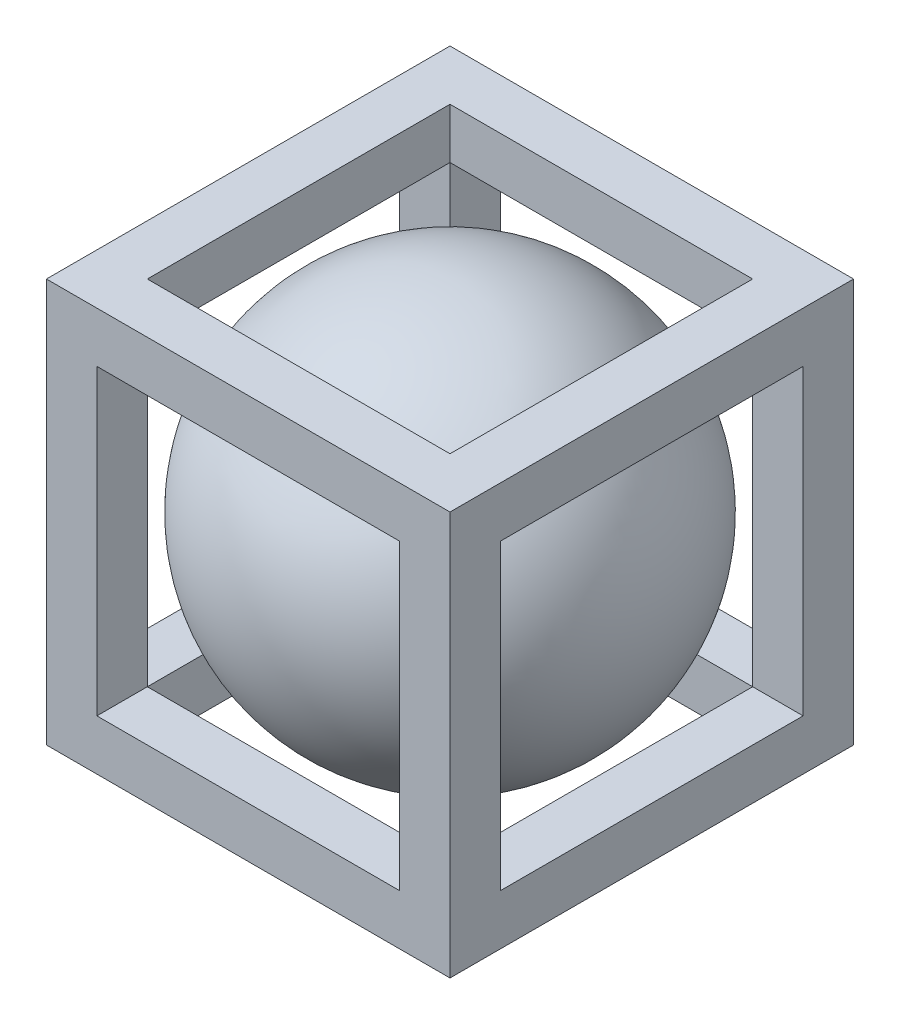
ISO-10303-21;
HEADER;
FILE_DESCRIPTION(('STEP AP214'),'2;1');
FILE_NAME('part.step','',(''),(''),'','','');
FILE_SCHEMA(('AUTOMOTIVE_DESIGN { 1 0 10303 214 1 1 1 1 }'));
ENDSEC;
DATA;
#1=APPLICATION_CONTEXT('core data for automotive mechanical design processes');
#2=APPLICATION_PROTOCOL_DEFINITION('international standard','automotive_design',2000,#1);
#3=PRODUCT_CONTEXT('',#1,'mechanical');
#4=PRODUCT('Part','Part','',(#3));
#5=PRODUCT_RELATED_PRODUCT_CATEGORY('part','',(#4));
#6=PRODUCT_DEFINITION_FORMATION('','',#4);
#7=PRODUCT_DEFINITION_CONTEXT('part definition',#1,'design');
#8=PRODUCT_DEFINITION('design','',#6,#7);
#9=PRODUCT_DEFINITION_SHAPE('','',#8);
#10=(LENGTH_UNIT() NAMED_UNIT(*) SI_UNIT(.MILLI.,.METRE.));
#11=(NAMED_UNIT(*) PLANE_ANGLE_UNIT() SI_UNIT($,.RADIAN.));
#12=(NAMED_UNIT(*) SI_UNIT($,.STERADIAN.) SOLID_ANGLE_UNIT());
#13=UNCERTAINTY_MEASURE_WITH_UNIT(LENGTH_MEASURE(1.E-05),#10,'distance_accuracy_value','');
#14=(GEOMETRIC_REPRESENTATION_CONTEXT(3) GLOBAL_UNCERTAINTY_ASSIGNED_CONTEXT((#13)) GLOBAL_UNIT_ASSIGNED_CONTEXT((#10,
#11,#12)) REPRESENTATION_CONTEXT('',''));
#15=CARTESIAN_POINT('',(0.,0.,0.));
#16=DIRECTION('',(0.,0.,1.));
#17=DIRECTION('',(1.,0.,0.));
#18=AXIS2_PLACEMENT_3D('',#15,#16,#17);
#19=CARTESIAN_POINT('',(0.,0.,0.));
#20=DIRECTION('',(-1.,0.,0.));
#21=DIRECTION('',(0.,1.,0.));
#22=AXIS2_PLACEMENT_3D('',#19,#20,#21);
#23=SPHERICAL_SURFACE('',#22,20.);
#24=CARTESIAN_POINT('',(-20.,0.,0.));
#25=VERTEX_POINT('',#24);
#26=VERTEX_LOOP('',#25);
#27=FACE_BOUND('',#26,.T.);
#28=ADVANCED_FACE('F45',(#27),#23,.T.);
#29=CLOSED_SHELL('',(#28));
#30=MANIFOLD_SOLID_BREP('B2',#29);
#31=CARTESIAN_POINT('',(15.,-15.,-20.));
#32=DIRECTION('',(1.,0.,0.));
#33=DIRECTION('',(0.,0.,-1.));
#34=AXIS2_PLACEMENT_3D('',#31,#32,#33);
#35=PLANE('',#34);
#36=DIRECTION('',(0.,0.,1.));
#37=VECTOR('',#36,1.);
#38=CARTESIAN_POINT('',(15.,-15.,-20.));
#39=LINE('',#38,#37);
#40=CARTESIAN_POINT('',(15.,-15.,-20.));
#41=VERTEX_POINT('',#40);
#42=CARTESIAN_POINT('',(15.,-15.,-15.));
#43=VERTEX_POINT('',#42);
#44=EDGE_CURVE('E331',#41,#43,#39,.T.);
#45=ORIENTED_EDGE('',*,*,#44,.T.);
#46=DIRECTION('',(0.,1.,0.));
#47=VECTOR('',#46,1.);
#48=CARTESIAN_POINT('',(15.,-15.,-15.));
#49=LINE('',#48,#47);
#50=CARTESIAN_POINT('',(15.,15.,-15.));
#51=VERTEX_POINT('',#50);
#52=EDGE_CURVE('E257',#43,#51,#49,.T.);
#53=ORIENTED_EDGE('',*,*,#52,.T.);
#54=DIRECTION('',(0.,0.,1.));
#55=VECTOR('',#54,1.);
#56=CARTESIAN_POINT('',(15.,15.,-20.));
#57=LINE('',#56,#55);
#58=CARTESIAN_POINT('',(15.,15.,-20.));
#59=VERTEX_POINT('',#58);
#60=EDGE_CURVE('E344',#59,#51,#57,.T.);
#61=ORIENTED_EDGE('',*,*,#60,.F.);
#62=DIRECTION('',(0.,1.,0.));
#63=VECTOR('',#62,1.);
#64=CARTESIAN_POINT('',(15.,-15.,-20.));
#65=LINE('',#64,#63);
#66=EDGE_CURVE('E318',#41,#59,#65,.T.);
#67=ORIENTED_EDGE('',*,*,#66,.F.);
#68=EDGE_LOOP('',(#45,#53,#61,#67));
#69=FACE_BOUND('',#68,.T.);
#70=ADVANCED_FACE('F58',(#69),#35,.F.);
#71=DIRECTION('',(0.,1.,0.));
#72=VECTOR('',#71,1.);
#73=CARTESIAN_POINT('',(15.,-20.,15.));
#74=LINE('',#73,#72);
#75=CARTESIAN_POINT('',(15.,-20.,15.));
#76=VERTEX_POINT('',#75);
#77=CARTESIAN_POINT('',(15.,-15.,15.));
#78=VERTEX_POINT('',#77);
#79=EDGE_CURVE('E285',#76,#78,#74,.T.);
#80=ORIENTED_EDGE('',*,*,#79,.T.);
#81=DIRECTION('',(0.,0.,-1.));
#82=VECTOR('',#81,1.);
#83=CARTESIAN_POINT('',(15.,-15.,-20.));
#84=LINE('',#83,#82);
#85=EDGE_CURVE('E246',#78,#43,#84,.T.);
#86=ORIENTED_EDGE('',*,*,#85,.T.);
#87=DIRECTION('',(0.,1.,0.));
#88=VECTOR('',#87,1.);
#89=CARTESIAN_POINT('',(15.,-20.,-15.));
#90=LINE('',#89,#88);
#91=CARTESIAN_POINT('',(15.,-20.,-15.));
#92=VERTEX_POINT('',#91);
#93=EDGE_CURVE('E298',#92,#43,#90,.T.);
#94=ORIENTED_EDGE('',*,*,#93,.F.);
#95=DIRECTION('',(0.,0.,-1.));
#96=VECTOR('',#95,1.);
#97=CARTESIAN_POINT('',(15.,-20.,15.));
#98=LINE('',#97,#96);
#99=EDGE_CURVE('E272',#76,#92,#98,.T.);
#100=ORIENTED_EDGE('',*,*,#99,.F.);
#101=EDGE_LOOP('',(#80,#86,#94,#100));
#102=FACE_BOUND('',#101,.T.);
#103=ADVANCED_FACE('F431',(#102),#35,.F.);
#104=CARTESIAN_POINT('',(15.,15.,15.));
#105=VERTEX_POINT('',#104);
#106=CARTESIAN_POINT('',(15.,15.,20.));
#107=VERTEX_POINT('',#106);
#108=EDGE_CURVE('E330',#105,#107,#57,.T.);
#109=ORIENTED_EDGE('',*,*,#108,.F.);
#110=DIRECTION('',(0.,-1.,0.));
#111=VECTOR('',#110,1.);
#112=CARTESIAN_POINT('',(15.,-15.,15.));
#113=LINE('',#112,#111);
#114=EDGE_CURVE('E205',#105,#78,#113,.T.);
#115=ORIENTED_EDGE('',*,*,#114,.T.);
#116=CARTESIAN_POINT('',(15.,-15.,20.));
#117=VERTEX_POINT('',#116);
#118=EDGE_CURVE('E335',#78,#117,#39,.T.);
#119=ORIENTED_EDGE('',*,*,#118,.T.);
#120=DIRECTION('',(0.,1.,0.));
#121=VECTOR('',#120,1.);
#122=CARTESIAN_POINT('',(15.,-15.,20.));
#123=LINE('',#122,#121);
#124=EDGE_CURVE('E306',#117,#107,#123,.T.);
#125=ORIENTED_EDGE('',*,*,#124,.T.);
#126=EDGE_LOOP('',(#109,#115,#119,#125));
#127=FACE_BOUND('',#126,.T.);
#128=ADVANCED_FACE('F390',(#127),#35,.F.);
#129=CARTESIAN_POINT('',(-15.,-15.,-20.));
#130=DIRECTION('',(-1.,0.,0.));
#131=DIRECTION('',(0.,0.,1.));
#132=AXIS2_PLACEMENT_3D('',#129,#130,#131);
#133=PLANE('',#132);
#134=DIRECTION('',(0.,0.,1.));
#135=VECTOR('',#134,1.);
#136=CARTESIAN_POINT('',(-15.,15.,-20.));
#137=LINE('',#136,#135);
#138=CARTESIAN_POINT('',(-15.,15.,-20.));
#139=VERTEX_POINT('',#138);
#140=CARTESIAN_POINT('',(-15.,15.,-15.));
#141=VERTEX_POINT('',#140);
#142=EDGE_CURVE('E340',#139,#141,#137,.T.);
#143=ORIENTED_EDGE('',*,*,#142,.T.);
#144=DIRECTION('',(0.,-1.,0.));
#145=VECTOR('',#144,1.);
#146=CARTESIAN_POINT('',(-15.,-15.,-15.));
#147=LINE('',#146,#145);
#148=CARTESIAN_POINT('',(-15.,-15.,-15.));
#149=VERTEX_POINT('',#148);
#150=EDGE_CURVE('E254',#141,#149,#147,.T.);
#151=ORIENTED_EDGE('',*,*,#150,.T.);
#152=DIRECTION('',(0.,0.,1.));
#153=VECTOR('',#152,1.);
#154=CARTESIAN_POINT('',(-15.,-15.,-20.));
#155=LINE('',#154,#153);
#156=CARTESIAN_POINT('',(-15.,-15.,-20.));
#157=VERTEX_POINT('',#156);
#158=EDGE_CURVE('E336',#157,#149,#155,.T.);
#159=ORIENTED_EDGE('',*,*,#158,.F.);
#160=DIRECTION('',(0.,-1.,0.));
#161=VECTOR('',#160,1.);
#162=CARTESIAN_POINT('',(-15.,-15.,-20.));
#163=LINE('',#162,#161);
#164=EDGE_CURVE('E324',#139,#157,#163,.T.);
#165=ORIENTED_EDGE('',*,*,#164,.F.);
#166=EDGE_LOOP('',(#143,#151,#159,#165));
#167=FACE_BOUND('',#166,.T.);
#168=ADVANCED_FACE('F447',(#167),#133,.F.);
#169=DIRECTION('',(0.,1.,0.));
#170=VECTOR('',#169,1.);
#171=CARTESIAN_POINT('',(-15.,-20.,-15.));
#172=LINE('',#171,#170);
#173=CARTESIAN_POINT('',(-15.,-20.,-15.));
#174=VERTEX_POINT('',#173);
#175=EDGE_CURVE('E294',#174,#149,#172,.T.);
#176=ORIENTED_EDGE('',*,*,#175,.T.);
#177=DIRECTION('',(0.,0.,1.));
#178=VECTOR('',#177,1.);
#179=CARTESIAN_POINT('',(-15.,-15.,-20.));
#180=LINE('',#179,#178);
#181=CARTESIAN_POINT('',(-15.,-15.,15.));
#182=VERTEX_POINT('',#181);
#183=EDGE_CURVE('E237',#149,#182,#180,.T.);
#184=ORIENTED_EDGE('',*,*,#183,.T.);
#185=DIRECTION('',(0.,1.,0.));
#186=VECTOR('',#185,1.);
#187=CARTESIAN_POINT('',(-15.,-20.,15.));
#188=LINE('',#187,#186);
#189=CARTESIAN_POINT('',(-15.,-20.,15.));
#190=VERTEX_POINT('',#189);
#191=EDGE_CURVE('E290',#190,#182,#188,.T.);
#192=ORIENTED_EDGE('',*,*,#191,.F.);
#193=DIRECTION('',(0.,0.,1.));
#194=VECTOR('',#193,1.);
#195=CARTESIAN_POINT('',(-15.,-20.,15.));
#196=LINE('',#195,#194);
#197=EDGE_CURVE('E278',#174,#190,#196,.T.);
#198=ORIENTED_EDGE('',*,*,#197,.F.);
#199=EDGE_LOOP('',(#176,#184,#192,#198));
#200=FACE_BOUND('',#199,.T.);
#201=ADVANCED_FACE('F408',(#200),#133,.F.);
#202=CARTESIAN_POINT('',(-15.,-15.,20.));
#203=VERTEX_POINT('',#202);
#204=EDGE_CURVE('E339',#182,#203,#155,.T.);
#205=ORIENTED_EDGE('',*,*,#204,.F.);
#206=DIRECTION('',(0.,1.,0.));
#207=VECTOR('',#206,1.);
#208=CARTESIAN_POINT('',(-15.,-15.,15.));
#209=LINE('',#208,#207);
#210=CARTESIAN_POINT('',(-15.,15.,15.));
#211=VERTEX_POINT('',#210);
#212=EDGE_CURVE('E43',#182,#211,#209,.T.);
#213=ORIENTED_EDGE('',*,*,#212,.T.);
#214=CARTESIAN_POINT('',(-15.,15.,20.));
#215=VERTEX_POINT('',#214);
#216=EDGE_CURVE('E343',#211,#215,#137,.T.);
#217=ORIENTED_EDGE('',*,*,#216,.T.);
#218=DIRECTION('',(0.,-1.,0.));
#219=VECTOR('',#218,1.);
#220=CARTESIAN_POINT('',(-15.,-15.,20.));
#221=LINE('',#220,#219);
#222=EDGE_CURVE('E312',#215,#203,#221,.T.);
#223=ORIENTED_EDGE('',*,*,#222,.T.);
#224=EDGE_LOOP('',(#205,#213,#217,#223));
#225=FACE_BOUND('',#224,.T.);
#226=ADVANCED_FACE('F402',(#225),#133,.F.);
#227=CARTESIAN_POINT('',(-15.,-15.,-20.));
#228=DIRECTION('',(0.,-1.,0.));
#229=DIRECTION('',(0.,0.,-1.));
#230=AXIS2_PLACEMENT_3D('',#227,#228,#229);
#231=PLANE('',#230);
#232=ORIENTED_EDGE('',*,*,#118,.F.);
#233=DIRECTION('',(-1.,0.,0.));
#234=VECTOR('',#233,1.);
#235=CARTESIAN_POINT('',(-15.,-15.,15.));
#236=LINE('',#235,#234);
#237=EDGE_CURVE('E303',#78,#182,#236,.T.);
#238=ORIENTED_EDGE('',*,*,#237,.T.);
#239=ORIENTED_EDGE('',*,*,#204,.T.);
#240=DIRECTION('',(1.,0.,0.));
#241=VECTOR('',#240,1.);
#242=CARTESIAN_POINT('',(-15.,-15.,20.));
#243=LINE('',#242,#241);
#244=EDGE_CURVE('E315',#203,#117,#243,.T.);
#245=ORIENTED_EDGE('',*,*,#244,.T.);
#246=EDGE_LOOP('',(#232,#238,#239,#245));
#247=FACE_BOUND('',#246,.T.);
#248=ADVANCED_FACE('F414',(#247),#231,.F.);
#249=CARTESIAN_POINT('',(-15.,15.,-20.));
#250=DIRECTION('',(0.,1.,0.));
#251=DIRECTION('',(0.,0.,1.));
#252=AXIS2_PLACEMENT_3D('',#249,#250,#251);
#253=PLANE('',#252);
#254=ORIENTED_EDGE('',*,*,#216,.F.);
#255=DIRECTION('',(1.,0.,0.));
#256=VECTOR('',#255,1.);
#257=CARTESIAN_POINT('',(-15.,15.,15.));
#258=LINE('',#257,#256);
#259=EDGE_CURVE('E66',#211,#105,#258,.T.);
#260=ORIENTED_EDGE('',*,*,#259,.T.);
#261=ORIENTED_EDGE('',*,*,#108,.T.);
#262=DIRECTION('',(-1.,0.,0.));
#263=VECTOR('',#262,1.);
#264=CARTESIAN_POINT('',(-15.,15.,20.));
#265=LINE('',#264,#263);
#266=EDGE_CURVE('E309',#107,#215,#265,.T.);
#267=ORIENTED_EDGE('',*,*,#266,.T.);
#268=EDGE_LOOP('',(#254,#260,#261,#267));
#269=FACE_BOUND('',#268,.T.);
#270=ADVANCED_FACE('F385',(#269),#253,.F.);
#271=CARTESIAN_POINT('',(20.,-20.,-20.));
#272=DIRECTION('',(1.,0.,0.));
#273=DIRECTION('',(0.,0.,-1.));
#274=AXIS2_PLACEMENT_3D('',#271,#272,#273);
#275=PLANE('',#274);
#276=DIRECTION('',(0.,1.,0.));
#277=VECTOR('',#276,1.);
#278=CARTESIAN_POINT('',(20.,-15.,-15.));
#279=LINE('',#278,#277);
#280=CARTESIAN_POINT('',(20.,-15.,-15.));
#281=VERTEX_POINT('',#280);
#282=CARTESIAN_POINT('',(20.,15.,-15.));
#283=VERTEX_POINT('',#282);
#284=EDGE_CURVE('E73',#281,#283,#279,.T.);
#285=ORIENTED_EDGE('',*,*,#284,.F.);
#286=DIRECTION('',(0.,0.,-1.));
#287=VECTOR('',#286,1.);
#288=CARTESIAN_POINT('',(20.,-15.,15.));
#289=LINE('',#288,#287);
#290=CARTESIAN_POINT('',(20.,-15.,15.));
#291=VERTEX_POINT('',#290);
#292=EDGE_CURVE('E219',#291,#281,#289,.T.);
#293=ORIENTED_EDGE('',*,*,#292,.F.);
#294=DIRECTION('',(0.,-1.,0.));
#295=VECTOR('',#294,1.);
#296=CARTESIAN_POINT('',(20.,-15.,15.));
#297=LINE('',#296,#295);
#298=CARTESIAN_POINT('',(20.,15.,15.));
#299=VERTEX_POINT('',#298);
#300=EDGE_CURVE('E202',#299,#291,#297,.T.);
#301=ORIENTED_EDGE('',*,*,#300,.F.);
#302=DIRECTION('',(0.,0.,1.));
#303=VECTOR('',#302,1.);
#304=CARTESIAN_POINT('',(20.,15.,15.));
#305=LINE('',#304,#303);
#306=EDGE_CURVE('E212',#283,#299,#305,.T.);
#307=ORIENTED_EDGE('',*,*,#306,.F.);
#308=EDGE_LOOP('',(#285,#293,#301,#307));
#309=FACE_BOUND('',#308,.T.);
#310=DIRECTION('',(0.,0.,1.));
#311=VECTOR('',#310,1.);
#312=CARTESIAN_POINT('',(20.,20.,-20.));
#313=LINE('',#312,#311);
#314=CARTESIAN_POINT('',(20.,20.,-20.));
#315=VERTEX_POINT('',#314);
#316=CARTESIAN_POINT('',(20.,20.,20.));
#317=VERTEX_POINT('',#316);
#318=EDGE_CURVE('E370',#315,#317,#313,.T.);
#319=ORIENTED_EDGE('',*,*,#318,.T.);
#320=DIRECTION('',(0.,1.,0.));
#321=VECTOR('',#320,1.);
#322=CARTESIAN_POINT('',(20.,-20.,20.));
#323=LINE('',#322,#321);
#324=CARTESIAN_POINT('',(20.,-20.,20.));
#325=VERTEX_POINT('',#324);
#326=EDGE_CURVE('E334',#325,#317,#323,.T.);
#327=ORIENTED_EDGE('',*,*,#326,.F.);
#328=DIRECTION('',(0.,0.,1.));
#329=VECTOR('',#328,1.);
#330=CARTESIAN_POINT('',(20.,-20.,-20.));
#331=LINE('',#330,#329);
#332=CARTESIAN_POINT('',(20.,-20.,-20.));
#333=VERTEX_POINT('',#332);
#334=EDGE_CURVE('E371',#333,#325,#331,.T.);
#335=ORIENTED_EDGE('',*,*,#334,.F.);
#336=DIRECTION('',(0.,1.,0.));
#337=VECTOR('',#336,1.);
#338=CARTESIAN_POINT('',(20.,-20.,-20.));
#339=LINE('',#338,#337);
#340=EDGE_CURVE('E358',#333,#315,#339,.T.);
#341=ORIENTED_EDGE('',*,*,#340,.T.);
#342=EDGE_LOOP('',(#319,#327,#335,#341));
#343=FACE_BOUND('',#342,.T.);
#344=ADVANCED_FACE('F60',(#309,#343),#275,.T.);
#345=CARTESIAN_POINT('',(-20.,-20.,-20.));
#346=DIRECTION('',(0.,-1.,0.));
#347=DIRECTION('',(0.,0.,-1.));
#348=AXIS2_PLACEMENT_3D('',#345,#346,#347);
#349=PLANE('',#348);
#350=ORIENTED_EDGE('',*,*,#99,.T.);
#351=DIRECTION('',(-1.,0.,0.));
#352=VECTOR('',#351,1.);
#353=CARTESIAN_POINT('',(-15.,-20.,-15.));
#354=LINE('',#353,#352);
#355=EDGE_CURVE('E275',#92,#174,#354,.T.);
#356=ORIENTED_EDGE('',*,*,#355,.T.);
#357=ORIENTED_EDGE('',*,*,#197,.T.);
#358=DIRECTION('',(1.,0.,0.));
#359=VECTOR('',#358,1.);
#360=CARTESIAN_POINT('',(-15.,-20.,15.));
#361=LINE('',#360,#359);
#362=EDGE_CURVE('E281',#190,#76,#361,.T.);
#363=ORIENTED_EDGE('',*,*,#362,.T.);
#364=EDGE_LOOP('',(#350,#356,#357,#363));
#365=FACE_BOUND('',#364,.T.);
#366=ORIENTED_EDGE('',*,*,#334,.T.);
#367=DIRECTION('',(1.,0.,0.));
#368=VECTOR('',#367,1.);
#369=CARTESIAN_POINT('',(-20.,-20.,20.));
#370=LINE('',#369,#368);
#371=CARTESIAN_POINT('',(-20.,-20.,20.));
#372=VERTEX_POINT('',#371);
#373=EDGE_CURVE('E355',#372,#325,#370,.T.);
#374=ORIENTED_EDGE('',*,*,#373,.F.);
#375=DIRECTION('',(0.,0.,1.));
#376=VECTOR('',#375,1.);
#377=CARTESIAN_POINT('',(-20.,-20.,-20.));
#378=LINE('',#377,#376);
#379=CARTESIAN_POINT('',(-20.,-20.,-20.));
#380=VERTEX_POINT('',#379);
#381=EDGE_CURVE('E374',#380,#372,#378,.T.);
#382=ORIENTED_EDGE('',*,*,#381,.F.);
#383=DIRECTION('',(1.,0.,0.));
#384=VECTOR('',#383,1.);
#385=CARTESIAN_POINT('',(-20.,-20.,-20.));
#386=LINE('',#385,#384);
#387=EDGE_CURVE('E367',#380,#333,#386,.T.);
#388=ORIENTED_EDGE('',*,*,#387,.T.);
#389=EDGE_LOOP('',(#366,#374,#382,#388));
#390=FACE_BOUND('',#389,.T.);
#391=ADVANCED_FACE('F491',(#365,#390),#349,.T.);
#392=CARTESIAN_POINT('',(-20.,-20.,-20.));
#393=DIRECTION('',(-1.,0.,0.));
#394=DIRECTION('',(0.,0.,1.));
#395=AXIS2_PLACEMENT_3D('',#392,#393,#394);
#396=PLANE('',#395);
#397=DIRECTION('',(0.,1.,0.));
#398=VECTOR('',#397,1.);
#399=CARTESIAN_POINT('',(-20.,-15.,-15.));
#400=LINE('',#399,#398);
#401=CARTESIAN_POINT('',(-20.,-15.,-15.));
#402=VERTEX_POINT('',#401);
#403=CARTESIAN_POINT('',(-20.,15.,-15.));
#404=VERTEX_POINT('',#403);
#405=EDGE_CURVE('E221',#402,#404,#400,.T.);
#406=ORIENTED_EDGE('',*,*,#405,.T.);
#407=DIRECTION('',(0.,0.,1.));
#408=VECTOR('',#407,1.);
#409=CARTESIAN_POINT('',(-20.,15.,15.));
#410=LINE('',#409,#408);
#411=CARTESIAN_POINT('',(-20.,15.,15.));
#412=VERTEX_POINT('',#411);
#413=EDGE_CURVE('E227',#404,#412,#410,.T.);
#414=ORIENTED_EDGE('',*,*,#413,.T.);
#415=DIRECTION('',(0.,-1.,0.));
#416=VECTOR('',#415,1.);
#417=CARTESIAN_POINT('',(-20.,-15.,15.));
#418=LINE('',#417,#416);
#419=CARTESIAN_POINT('',(-20.,-15.,15.));
#420=VERTEX_POINT('',#419);
#421=EDGE_CURVE('E81',#412,#420,#418,.T.);
#422=ORIENTED_EDGE('',*,*,#421,.T.);
#423=DIRECTION('',(0.,0.,-1.));
#424=VECTOR('',#423,1.);
#425=CARTESIAN_POINT('',(-20.,-15.,15.));
#426=LINE('',#425,#424);
#427=EDGE_CURVE('E231',#420,#402,#426,.T.);
#428=ORIENTED_EDGE('',*,*,#427,.T.);
#429=EDGE_LOOP('',(#406,#414,#422,#428));
#430=FACE_BOUND('',#429,.T.);
#431=ORIENTED_EDGE('',*,*,#381,.T.);
#432=DIRECTION('',(0.,-1.,0.));
#433=VECTOR('',#432,1.);
#434=CARTESIAN_POINT('',(-20.,-20.,20.));
#435=LINE('',#434,#433);
#436=CARTESIAN_POINT('',(-20.,20.,20.));
#437=VERTEX_POINT('',#436);
#438=EDGE_CURVE('E352',#437,#372,#435,.T.);
#439=ORIENTED_EDGE('',*,*,#438,.F.);
#440=DIRECTION('',(0.,0.,1.));
#441=VECTOR('',#440,1.);
#442=CARTESIAN_POINT('',(-20.,20.,-20.));
#443=LINE('',#442,#441);
#444=CARTESIAN_POINT('',(-20.,20.,-20.));
#445=VERTEX_POINT('',#444);
#446=EDGE_CURVE('E376',#445,#437,#443,.T.);
#447=ORIENTED_EDGE('',*,*,#446,.F.);
#448=DIRECTION('',(0.,-1.,0.));
#449=VECTOR('',#448,1.);
#450=CARTESIAN_POINT('',(-20.,-20.,-20.));
#451=LINE('',#450,#449);
#452=EDGE_CURVE('E364',#445,#380,#451,.T.);
#453=ORIENTED_EDGE('',*,*,#452,.T.);
#454=EDGE_LOOP('',(#431,#439,#447,#453));
#455=FACE_BOUND('',#454,.T.);
#456=ADVANCED_FACE('F494',(#430,#455),#396,.T.);
#457=CARTESIAN_POINT('',(-20.,20.,-20.));
#458=DIRECTION('',(0.,1.,0.));
#459=DIRECTION('',(0.,0.,1.));
#460=AXIS2_PLACEMENT_3D('',#457,#458,#459);
#461=PLANE('',#460);
#462=DIRECTION('',(0.,0.,-1.));
#463=VECTOR('',#462,1.);
#464=CARTESIAN_POINT('',(15.,20.,15.));
#465=LINE('',#464,#463);
#466=CARTESIAN_POINT('',(15.,20.,15.));
#467=VERTEX_POINT('',#466);
#468=CARTESIAN_POINT('',(15.,20.,-15.));
#469=VERTEX_POINT('',#468);
#470=EDGE_CURVE('E261',#467,#469,#465,.T.);
#471=ORIENTED_EDGE('',*,*,#470,.F.);
#472=DIRECTION('',(1.,0.,0.));
#473=VECTOR('',#472,1.);
#474=CARTESIAN_POINT('',(-15.,20.,15.));
#475=LINE('',#474,#473);
#476=CARTESIAN_POINT('',(-15.,20.,15.));
#477=VERTEX_POINT('',#476);
#478=EDGE_CURVE('E269',#477,#467,#475,.T.);
#479=ORIENTED_EDGE('',*,*,#478,.F.);
#480=DIRECTION('',(0.,0.,1.));
#481=VECTOR('',#480,1.);
#482=CARTESIAN_POINT('',(-15.,20.,15.));
#483=LINE('',#482,#481);
#484=CARTESIAN_POINT('',(-15.,20.,-15.));
#485=VERTEX_POINT('',#484);
#486=EDGE_CURVE('E266',#485,#477,#483,.T.);
#487=ORIENTED_EDGE('',*,*,#486,.F.);
#488=DIRECTION('',(-1.,0.,0.));
#489=VECTOR('',#488,1.);
#490=CARTESIAN_POINT('',(-15.,20.,-15.));
#491=LINE('',#490,#489);
#492=EDGE_CURVE('E263',#469,#485,#491,.T.);
#493=ORIENTED_EDGE('',*,*,#492,.F.);
#494=EDGE_LOOP('',(#471,#479,#487,#493));
#495=FACE_BOUND('',#494,.T.);
#496=ORIENTED_EDGE('',*,*,#446,.T.);
#497=DIRECTION('',(-1.,0.,0.));
#498=VECTOR('',#497,1.);
#499=CARTESIAN_POINT('',(-20.,20.,20.));
#500=LINE('',#499,#498);
#501=EDGE_CURVE('E349',#317,#437,#500,.T.);
#502=ORIENTED_EDGE('',*,*,#501,.F.);
#503=ORIENTED_EDGE('',*,*,#318,.F.);
#504=DIRECTION('',(-1.,0.,0.));
#505=VECTOR('',#504,1.);
#506=CARTESIAN_POINT('',(-20.,20.,-20.));
#507=LINE('',#506,#505);
#508=EDGE_CURVE('E361',#315,#445,#507,.T.);
#509=ORIENTED_EDGE('',*,*,#508,.T.);
#510=EDGE_LOOP('',(#496,#502,#503,#509));
#511=FACE_BOUND('',#510,.T.);
#512=ADVANCED_FACE('F469',(#495,#511),#461,.T.);
#513=CARTESIAN_POINT('',(0.,0.,-20.));
#514=DIRECTION('',(0.,0.,-1.));
#515=DIRECTION('',(-1.,0.,0.));
#516=AXIS2_PLACEMENT_3D('',#513,#514,#515);
#517=PLANE('',#516);
#518=ORIENTED_EDGE('',*,*,#66,.T.);
#519=DIRECTION('',(-1.,0.,0.));
#520=VECTOR('',#519,1.);
#521=CARTESIAN_POINT('',(-15.,15.,-20.));
#522=LINE('',#521,#520);
#523=EDGE_CURVE('E321',#59,#139,#522,.T.);
#524=ORIENTED_EDGE('',*,*,#523,.T.);
#525=ORIENTED_EDGE('',*,*,#164,.T.);
#526=DIRECTION('',(1.,0.,0.));
#527=VECTOR('',#526,1.);
#528=CARTESIAN_POINT('',(-15.,-15.,-20.));
#529=LINE('',#528,#527);
#530=EDGE_CURVE('E327',#157,#41,#529,.T.);
#531=ORIENTED_EDGE('',*,*,#530,.T.);
#532=EDGE_LOOP('',(#518,#524,#525,#531));
#533=FACE_BOUND('',#532,.T.);
#534=ORIENTED_EDGE('',*,*,#340,.F.);
#535=ORIENTED_EDGE('',*,*,#387,.F.);
#536=ORIENTED_EDGE('',*,*,#452,.F.);
#537=ORIENTED_EDGE('',*,*,#508,.F.);
#538=EDGE_LOOP('',(#534,#535,#536,#537));
#539=FACE_BOUND('',#538,.T.);
#540=ADVANCED_FACE('F444',(#533,#539),#517,.T.);
#541=CARTESIAN_POINT('',(0.,0.,20.));
#542=DIRECTION('',(0.,0.,-1.));
#543=DIRECTION('',(-1.,0.,0.));
#544=AXIS2_PLACEMENT_3D('',#541,#542,#543);
#545=PLANE('',#544);
#546=ORIENTED_EDGE('',*,*,#266,.F.);
#547=ORIENTED_EDGE('',*,*,#124,.F.);
#548=ORIENTED_EDGE('',*,*,#244,.F.);
#549=ORIENTED_EDGE('',*,*,#222,.F.);
#550=EDGE_LOOP('',(#546,#547,#548,#549));
#551=FACE_BOUND('',#550,.T.);
#552=ORIENTED_EDGE('',*,*,#326,.T.);
#553=ORIENTED_EDGE('',*,*,#501,.T.);
#554=ORIENTED_EDGE('',*,*,#438,.T.);
#555=ORIENTED_EDGE('',*,*,#373,.T.);
#556=EDGE_LOOP('',(#552,#553,#554,#555));
#557=FACE_BOUND('',#556,.T.);
#558=ADVANCED_FACE('F398',(#551,#557),#545,.F.);
#559=EDGE_CURVE('E284',#51,#469,#90,.T.);
#560=ORIENTED_EDGE('',*,*,#559,.F.);
#561=DIRECTION('',(0.,0.,1.));
#562=VECTOR('',#561,1.);
#563=CARTESIAN_POINT('',(15.,15.,-20.));
#564=LINE('',#563,#562);
#565=EDGE_CURVE('E252',#51,#105,#564,.T.);
#566=ORIENTED_EDGE('',*,*,#565,.T.);
#567=EDGE_CURVE('E289',#105,#467,#74,.T.);
#568=ORIENTED_EDGE('',*,*,#567,.T.);
#569=ORIENTED_EDGE('',*,*,#470,.T.);
#570=EDGE_LOOP('',(#560,#566,#568,#569));
#571=FACE_BOUND('',#570,.T.);
#572=ADVANCED_FACE('F428',(#571),#35,.F.);
#573=ORIENTED_EDGE('',*,*,#158,.T.);
#574=DIRECTION('',(1.,0.,0.));
#575=VECTOR('',#574,1.);
#576=CARTESIAN_POINT('',(-15.,-15.,-15.));
#577=LINE('',#576,#575);
#578=EDGE_CURVE('E288',#149,#43,#577,.T.);
#579=ORIENTED_EDGE('',*,*,#578,.T.);
#580=ORIENTED_EDGE('',*,*,#44,.F.);
#581=ORIENTED_EDGE('',*,*,#530,.F.);
#582=EDGE_LOOP('',(#573,#579,#580,#581));
#583=FACE_BOUND('',#582,.T.);
#584=ADVANCED_FACE('F417',(#583),#231,.F.);
#585=EDGE_CURVE('E293',#211,#477,#188,.T.);
#586=ORIENTED_EDGE('',*,*,#585,.F.);
#587=DIRECTION('',(0.,0.,-1.));
#588=VECTOR('',#587,1.);
#589=CARTESIAN_POINT('',(-15.,15.,-20.));
#590=LINE('',#589,#588);
#591=EDGE_CURVE('E249',#211,#141,#590,.T.);
#592=ORIENTED_EDGE('',*,*,#591,.T.);
#593=EDGE_CURVE('E297',#141,#485,#172,.T.);
#594=ORIENTED_EDGE('',*,*,#593,.T.);
#595=ORIENTED_EDGE('',*,*,#486,.T.);
#596=EDGE_LOOP('',(#586,#592,#594,#595));
#597=FACE_BOUND('',#596,.T.);
#598=ADVANCED_FACE('F425',(#597),#133,.F.);
#599=ORIENTED_EDGE('',*,*,#60,.T.);
#600=DIRECTION('',(-1.,0.,0.));
#601=VECTOR('',#600,1.);
#602=CARTESIAN_POINT('',(-15.,15.,-15.));
#603=LINE('',#602,#601);
#604=EDGE_CURVE('E373',#51,#141,#603,.T.);
#605=ORIENTED_EDGE('',*,*,#604,.T.);
#606=ORIENTED_EDGE('',*,*,#142,.F.);
#607=ORIENTED_EDGE('',*,*,#523,.F.);
#608=EDGE_LOOP('',(#599,#605,#606,#607));
#609=FACE_BOUND('',#608,.T.);
#610=ADVANCED_FACE('F423',(#609),#253,.F.);
#611=CARTESIAN_POINT('',(-15.,-20.,-15.));
#612=DIRECTION('',(0.,0.,-1.));
#613=DIRECTION('',(-1.,0.,0.));
#614=AXIS2_PLACEMENT_3D('',#611,#612,#613);
#615=PLANE('',#614);
#616=ORIENTED_EDGE('',*,*,#559,.T.);
#617=ORIENTED_EDGE('',*,*,#492,.T.);
#618=ORIENTED_EDGE('',*,*,#593,.F.);
#619=ORIENTED_EDGE('',*,*,#604,.F.);
#620=EDGE_LOOP('',(#616,#617,#618,#619));
#621=FACE_BOUND('',#620,.T.);
#622=ADVANCED_FACE('F460',(#621),#615,.F.);
#623=CARTESIAN_POINT('',(-15.,-20.,15.));
#624=DIRECTION('',(0.,0.,1.));
#625=DIRECTION('',(1.,0.,0.));
#626=AXIS2_PLACEMENT_3D('',#623,#624,#625);
#627=PLANE('',#626);
#628=ORIENTED_EDGE('',*,*,#585,.T.);
#629=ORIENTED_EDGE('',*,*,#478,.T.);
#630=ORIENTED_EDGE('',*,*,#567,.F.);
#631=ORIENTED_EDGE('',*,*,#259,.F.);
#632=EDGE_LOOP('',(#628,#629,#630,#631));
#633=FACE_BOUND('',#632,.T.);
#634=ADVANCED_FACE('F465',(#633),#627,.F.);
#635=ORIENTED_EDGE('',*,*,#79,.F.);
#636=ORIENTED_EDGE('',*,*,#362,.F.);
#637=ORIENTED_EDGE('',*,*,#191,.T.);
#638=ORIENTED_EDGE('',*,*,#237,.F.);
#639=EDGE_LOOP('',(#635,#636,#637,#638));
#640=FACE_BOUND('',#639,.T.);
#641=ADVANCED_FACE('F412',(#640),#627,.F.);
#642=ORIENTED_EDGE('',*,*,#175,.F.);
#643=ORIENTED_EDGE('',*,*,#355,.F.);
#644=ORIENTED_EDGE('',*,*,#93,.T.);
#645=ORIENTED_EDGE('',*,*,#578,.F.);
#646=EDGE_LOOP('',(#642,#643,#644,#645));
#647=FACE_BOUND('',#646,.T.);
#648=ADVANCED_FACE('F489',(#647),#615,.F.);
#649=CARTESIAN_POINT('',(-20.,15.,15.));
#650=DIRECTION('',(0.,1.,0.));
#651=DIRECTION('',(0.,0.,1.));
#652=AXIS2_PLACEMENT_3D('',#649,#650,#651);
#653=PLANE('',#652);
#654=DIRECTION('',(1.,0.,0.));
#655=VECTOR('',#654,1.);
#656=CARTESIAN_POINT('',(-20.,15.,15.));
#657=LINE('',#656,#655);
#658=EDGE_CURVE('E208',#412,#211,#657,.T.);
#659=ORIENTED_EDGE('',*,*,#658,.F.);
#660=ORIENTED_EDGE('',*,*,#413,.F.);
#661=DIRECTION('',(1.,0.,0.));
#662=VECTOR('',#661,1.);
#663=CARTESIAN_POINT('',(-20.,15.,-15.));
#664=LINE('',#663,#662);
#665=EDGE_CURVE('E209',#404,#141,#664,.T.);
#666=ORIENTED_EDGE('',*,*,#665,.T.);
#667=ORIENTED_EDGE('',*,*,#591,.F.);
#668=EDGE_LOOP('',(#659,#660,#666,#667));
#669=FACE_BOUND('',#668,.T.);
#670=ADVANCED_FACE('F520',(#669),#653,.F.);
#671=CARTESIAN_POINT('',(-20.,-15.,15.));
#672=DIRECTION('',(0.,0.,1.));
#673=DIRECTION('',(1.,0.,0.));
#674=AXIS2_PLACEMENT_3D('',#671,#672,#673);
#675=PLANE('',#674);
#676=DIRECTION('',(1.,0.,0.));
#677=VECTOR('',#676,1.);
#678=CARTESIAN_POINT('',(-20.,-15.,15.));
#679=LINE('',#678,#677);
#680=EDGE_CURVE('E239',#420,#182,#679,.T.);
#681=ORIENTED_EDGE('',*,*,#680,.F.);
#682=ORIENTED_EDGE('',*,*,#421,.F.);
#683=ORIENTED_EDGE('',*,*,#658,.T.);
#684=ORIENTED_EDGE('',*,*,#212,.F.);
#685=EDGE_LOOP('',(#681,#682,#683,#684));
#686=FACE_BOUND('',#685,.T.);
#687=ADVANCED_FACE('F403',(#686),#675,.F.);
#688=CARTESIAN_POINT('',(-20.,-15.,15.));
#689=DIRECTION('',(0.,-1.,0.));
#690=DIRECTION('',(0.,0.,-1.));
#691=AXIS2_PLACEMENT_3D('',#688,#689,#690);
#692=PLANE('',#691);
#693=DIRECTION('',(1.,0.,0.));
#694=VECTOR('',#693,1.);
#695=CARTESIAN_POINT('',(-20.,-15.,-15.));
#696=LINE('',#695,#694);
#697=EDGE_CURVE('E234',#402,#149,#696,.T.);
#698=ORIENTED_EDGE('',*,*,#697,.F.);
#699=ORIENTED_EDGE('',*,*,#427,.F.);
#700=ORIENTED_EDGE('',*,*,#680,.T.);
#701=ORIENTED_EDGE('',*,*,#183,.F.);
#702=EDGE_LOOP('',(#698,#699,#700,#701));
#703=FACE_BOUND('',#702,.T.);
#704=ADVANCED_FACE('F406',(#703),#692,.F.);
#705=CARTESIAN_POINT('',(-20.,-15.,-15.));
#706=DIRECTION('',(0.,0.,-1.));
#707=DIRECTION('',(-1.,0.,0.));
#708=AXIS2_PLACEMENT_3D('',#705,#706,#707);
#709=PLANE('',#708);
#710=ORIENTED_EDGE('',*,*,#665,.F.);
#711=ORIENTED_EDGE('',*,*,#405,.F.);
#712=ORIENTED_EDGE('',*,*,#697,.T.);
#713=ORIENTED_EDGE('',*,*,#150,.F.);
#714=EDGE_LOOP('',(#710,#711,#712,#713));
#715=FACE_BOUND('',#714,.T.);
#716=ADVANCED_FACE('F518',(#715),#709,.F.);
#717=EDGE_CURVE('E197',#105,#299,#657,.T.);
#718=ORIENTED_EDGE('',*,*,#717,.T.);
#719=ORIENTED_EDGE('',*,*,#300,.T.);
#720=EDGE_CURVE('E241',#78,#291,#679,.T.);
#721=ORIENTED_EDGE('',*,*,#720,.F.);
#722=ORIENTED_EDGE('',*,*,#114,.F.);
#723=EDGE_LOOP('',(#718,#719,#721,#722));
#724=FACE_BOUND('',#723,.T.);
#725=ADVANCED_FACE('F199',(#724),#675,.F.);
#726=EDGE_CURVE('E238',#43,#281,#696,.T.);
#727=ORIENTED_EDGE('',*,*,#726,.T.);
#728=ORIENTED_EDGE('',*,*,#284,.T.);
#729=EDGE_CURVE('E214',#51,#283,#664,.T.);
#730=ORIENTED_EDGE('',*,*,#729,.F.);
#731=ORIENTED_EDGE('',*,*,#52,.F.);
#732=EDGE_LOOP('',(#727,#728,#730,#731));
#733=FACE_BOUND('',#732,.T.);
#734=ADVANCED_FACE('F483',(#733),#709,.F.);
#735=ORIENTED_EDGE('',*,*,#729,.T.);
#736=ORIENTED_EDGE('',*,*,#306,.T.);
#737=ORIENTED_EDGE('',*,*,#717,.F.);
#738=ORIENTED_EDGE('',*,*,#565,.F.);
#739=EDGE_LOOP('',(#735,#736,#737,#738));
#740=FACE_BOUND('',#739,.T.);
#741=ADVANCED_FACE('F213',(#740),#653,.F.);
#742=ORIENTED_EDGE('',*,*,#720,.T.);
#743=ORIENTED_EDGE('',*,*,#292,.T.);
#744=ORIENTED_EDGE('',*,*,#726,.F.);
#745=ORIENTED_EDGE('',*,*,#85,.F.);
#746=EDGE_LOOP('',(#742,#743,#744,#745));
#747=FACE_BOUND('',#746,.T.);
#748=ADVANCED_FACE('F485',(#747),#692,.F.);
#749=CLOSED_SHELL('',(#70,#103,#128,#168,#201,#226,#248,#270,#344,#391,#456,#512,#540,#558,#572,
#584,#598,#610,#622,#634,#641,#648,#670,#687,#704,#716,#725,#734,#741,#748));
#750=MANIFOLD_SOLID_BREP('B6',#749);
#751=ADVANCED_BREP_SHAPE_REPRESENTATION('',(#18,#30,#750),#14);
#752=SHAPE_DEFINITION_REPRESENTATION(#9,#751);
ENDSEC;
END-ISO-10303-21;
